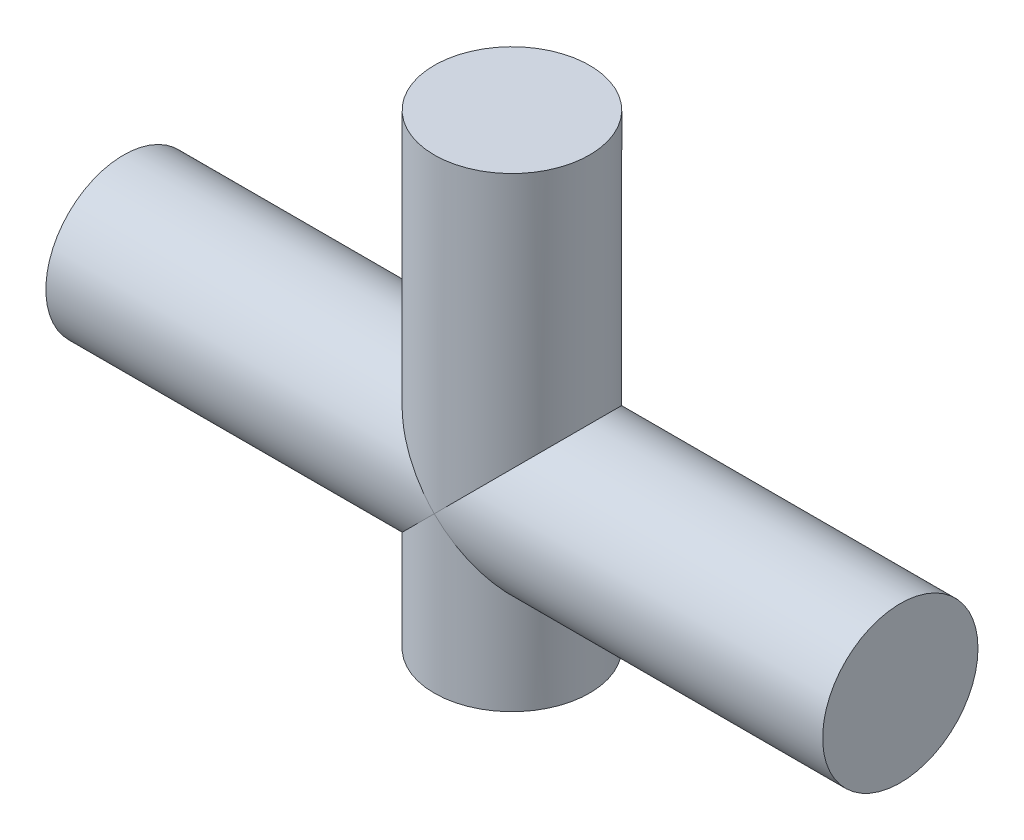
ISO-10303-21;
HEADER;
FILE_DESCRIPTION(('STEP AP214'),'2;1');
FILE_NAME('part.step','',(''),(''),'','','');
FILE_SCHEMA(('AUTOMOTIVE_DESIGN { 1 0 10303 214 1 1 1 1 }'));
ENDSEC;
DATA;
#1=APPLICATION_CONTEXT('core data for automotive mechanical design processes');
#2=APPLICATION_PROTOCOL_DEFINITION('international standard','automotive_design',2000,#1);
#3=PRODUCT_CONTEXT('',#1,'mechanical');
#4=PRODUCT('Part','Part','',(#3));
#5=PRODUCT_RELATED_PRODUCT_CATEGORY('part','',(#4));
#6=PRODUCT_DEFINITION_FORMATION('','',#4);
#7=PRODUCT_DEFINITION_CONTEXT('part definition',#1,'design');
#8=PRODUCT_DEFINITION('design','',#6,#7);
#9=PRODUCT_DEFINITION_SHAPE('','',#8);
#10=(LENGTH_UNIT() NAMED_UNIT(*) SI_UNIT(.MILLI.,.METRE.));
#11=(NAMED_UNIT(*) PLANE_ANGLE_UNIT() SI_UNIT($,.RADIAN.));
#12=(NAMED_UNIT(*) SI_UNIT($,.STERADIAN.) SOLID_ANGLE_UNIT());
#13=UNCERTAINTY_MEASURE_WITH_UNIT(LENGTH_MEASURE(1.E-05),#10,'distance_accuracy_value','');
#14=(GEOMETRIC_REPRESENTATION_CONTEXT(3) GLOBAL_UNCERTAINTY_ASSIGNED_CONTEXT((#13)) GLOBAL_UNIT_ASSIGNED_CONTEXT((#10,
#11,#12)) REPRESENTATION_CONTEXT('',''));
#15=CARTESIAN_POINT('',(0.,0.,0.));
#16=DIRECTION('',(0.,0.,1.));
#17=DIRECTION('',(1.,0.,0.));
#18=AXIS2_PLACEMENT_3D('',#15,#16,#17);
#19=CARTESIAN_POINT('',(-31.75,0.,0.));
#20=DIRECTION('',(1.,0.,0.));
#21=DIRECTION('',(0.,0.,-1.));
#22=AXIS2_PLACEMENT_3D('',#19,#20,#21);
#23=CYLINDRICAL_SURFACE('',#22,6.35);
#24=CARTESIAN_POINT('',(0.,0.,0.));
#25=DIRECTION('',(0.707106781186547,0.707106781186547,0.));
#26=DIRECTION('',(0.707106781186547,-0.707106781186547,0.));
#27=AXIS2_PLACEMENT_3D('',#24,#25,#26);
#28=ELLIPSE('',#27,8.98025612106915,6.35);
#29=CARTESIAN_POINT('',(0.,0.,-6.35));
#30=VERTEX_POINT('',#29);
#31=CARTESIAN_POINT('',(0.,0.,6.35));
#32=VERTEX_POINT('',#31);
#33=EDGE_CURVE('E40',#30,#32,#28,.T.);
#34=ORIENTED_EDGE('',*,*,#33,.F.);
#35=CARTESIAN_POINT('',(0.,0.,0.));
#36=DIRECTION('',(0.707106781186547,-0.707106781186547,0.));
#37=DIRECTION('',(0.707106781186547,0.707106781186547,0.));
#38=AXIS2_PLACEMENT_3D('',#35,#36,#37);
#39=ELLIPSE('',#38,8.98025612106915,6.35);
#40=EDGE_CURVE('E52',#32,#30,#39,.T.);
#41=ORIENTED_EDGE('',*,*,#40,.F.);
#42=EDGE_LOOP('',(#34,#41));
#43=FACE_BOUND('',#42,.T.);
#44=CARTESIAN_POINT('',(-31.75,0.,0.));
#45=DIRECTION('',(1.,0.,0.));
#46=DIRECTION('',(0.,0.,-1.));
#47=AXIS2_PLACEMENT_3D('',#44,#45,#46);
#48=CIRCLE('',#47,6.35);
#49=CARTESIAN_POINT('',(-31.75,0.,-6.35));
#50=VERTEX_POINT('',#49);
#51=EDGE_CURVE('E59',#50,#50,#48,.T.);
#52=ORIENTED_EDGE('',*,*,#51,.T.);
#53=EDGE_LOOP('',(#52));
#54=FACE_BOUND('',#53,.T.);
#55=ADVANCED_FACE('F33',(#43,#54),#23,.T.);
#56=CARTESIAN_POINT('',(-31.75,0.,0.));
#57=DIRECTION('',(1.,0.,0.));
#58=DIRECTION('',(0.,0.,-1.));
#59=AXIS2_PLACEMENT_3D('',#56,#57,#58);
#60=PLANE('',#59);
#61=ORIENTED_EDGE('',*,*,#51,.F.);
#62=EDGE_LOOP('',(#61));
#63=FACE_BOUND('',#62,.T.);
#64=ADVANCED_FACE('F82',(#63),#60,.F.);
#65=CARTESIAN_POINT('',(0.,25.4,0.));
#66=DIRECTION('',(0.,1.,0.));
#67=DIRECTION('',(0.,0.,1.));
#68=AXIS2_PLACEMENT_3D('',#65,#66,#67);
#69=PLANE('',#68);
#70=CARTESIAN_POINT('',(0.,25.4,0.));
#71=DIRECTION('',(0.,1.,0.));
#72=DIRECTION('',(0.,0.,1.));
#73=AXIS2_PLACEMENT_3D('',#70,#71,#72);
#74=CIRCLE('',#73,6.35);
#75=CARTESIAN_POINT('',(0.,25.4,6.35));
#76=VERTEX_POINT('',#75);
#77=EDGE_CURVE('E72',#76,#76,#74,.T.);
#78=ORIENTED_EDGE('',*,*,#77,.T.);
#79=EDGE_LOOP('',(#78));
#80=FACE_BOUND('',#79,.T.);
#81=ADVANCED_FACE('F84',(#80),#69,.T.);
#82=CARTESIAN_POINT('',(0.,-12.7,0.));
#83=DIRECTION('',(0.,1.,0.));
#84=DIRECTION('',(0.,0.,1.));
#85=AXIS2_PLACEMENT_3D('',#82,#83,#84);
#86=CYLINDRICAL_SURFACE('',#85,6.35);
#87=ORIENTED_EDGE('',*,*,#77,.F.);
#88=EDGE_LOOP('',(#87));
#89=FACE_BOUND('',#88,.T.);
#90=CARTESIAN_POINT('',(0.,0.,0.));
#91=DIRECTION('',(0.707106781186547,-0.707106781186547,0.));
#92=DIRECTION('',(0.707106781186547,0.707106781186547,0.));
#93=AXIS2_PLACEMENT_3D('',#90,#91,#92);
#94=ELLIPSE('',#93,8.98025612106915,6.35);
#95=EDGE_CURVE('E46',#32,#30,#94,.F.);
#96=ORIENTED_EDGE('',*,*,#95,.T.);
#97=ORIENTED_EDGE('',*,*,#33,.T.);
#98=EDGE_LOOP('',(#96,#97));
#99=FACE_BOUND('',#98,.T.);
#100=ADVANCED_FACE('F61',(#89,#99),#86,.T.);
#101=CARTESIAN_POINT('',(31.75,0.,0.));
#102=DIRECTION('',(1.,0.,0.));
#103=DIRECTION('',(0.,0.,-1.));
#104=AXIS2_PLACEMENT_3D('',#101,#102,#103);
#105=PLANE('',#104);
#106=CARTESIAN_POINT('',(31.75,0.,0.));
#107=DIRECTION('',(1.,0.,0.));
#108=DIRECTION('',(0.,0.,-1.));
#109=AXIS2_PLACEMENT_3D('',#106,#107,#108);
#110=CIRCLE('',#109,6.35);
#111=CARTESIAN_POINT('',(31.75,0.,-6.35));
#112=VERTEX_POINT('',#111);
#113=EDGE_CURVE('E71',#112,#112,#110,.T.);
#114=ORIENTED_EDGE('',*,*,#113,.T.);
#115=EDGE_LOOP('',(#114));
#116=FACE_BOUND('',#115,.T.);
#117=ADVANCED_FACE('F92',(#116),#105,.T.);
#118=CARTESIAN_POINT('',(0.,0.,0.));
#119=DIRECTION('',(0.707106781186547,0.707106781186547,0.));
#120=DIRECTION('',(0.707106781186547,-0.707106781186547,0.));
#121=AXIS2_PLACEMENT_3D('',#118,#119,#120);
#122=ELLIPSE('',#121,8.98025612106915,6.35);
#123=EDGE_CURVE('E11',#30,#32,#122,.F.);
#124=ORIENTED_EDGE('',*,*,#123,.F.);
#125=ORIENTED_EDGE('',*,*,#95,.F.);
#126=EDGE_LOOP('',(#124,#125));
#127=FACE_BOUND('',#126,.T.);
#128=ORIENTED_EDGE('',*,*,#113,.F.);
#129=EDGE_LOOP('',(#128));
#130=FACE_BOUND('',#129,.T.);
#131=ADVANCED_FACE('F57',(#127,#130),#23,.T.);
#132=ORIENTED_EDGE('',*,*,#40,.T.);
#133=ORIENTED_EDGE('',*,*,#123,.T.);
#134=EDGE_LOOP('',(#132,#133));
#135=FACE_BOUND('',#134,.T.);
#136=CARTESIAN_POINT('',(0.,-12.7,0.));
#137=DIRECTION('',(0.,1.,0.));
#138=DIRECTION('',(0.,0.,1.));
#139=AXIS2_PLACEMENT_3D('',#136,#137,#138);
#140=CIRCLE('',#139,6.35);
#141=CARTESIAN_POINT('',(0.,-12.7,6.35));
#142=VERTEX_POINT('',#141);
#143=EDGE_CURVE('E69',#142,#142,#140,.T.);
#144=ORIENTED_EDGE('',*,*,#143,.T.);
#145=EDGE_LOOP('',(#144));
#146=FACE_BOUND('',#145,.T.);
#147=ADVANCED_FACE('F62',(#135,#146),#86,.T.);
#148=CARTESIAN_POINT('',(0.,-12.7,0.));
#149=DIRECTION('',(0.,1.,0.));
#150=DIRECTION('',(0.,0.,1.));
#151=AXIS2_PLACEMENT_3D('',#148,#149,#150);
#152=PLANE('',#151);
#153=ORIENTED_EDGE('',*,*,#143,.F.);
#154=EDGE_LOOP('',(#153));
#155=FACE_BOUND('',#154,.T.);
#156=ADVANCED_FACE('F65',(#155),#152,.F.);
#157=CLOSED_SHELL('',(#55,#64,#81,#100,#117,#131,#147,#156));
#158=MANIFOLD_SOLID_BREP('B2',#157);
#159=ADVANCED_BREP_SHAPE_REPRESENTATION('',(#18,#158),#14);
#160=SHAPE_DEFINITION_REPRESENTATION(#9,#159);
ENDSEC;
END-ISO-10303-21;
